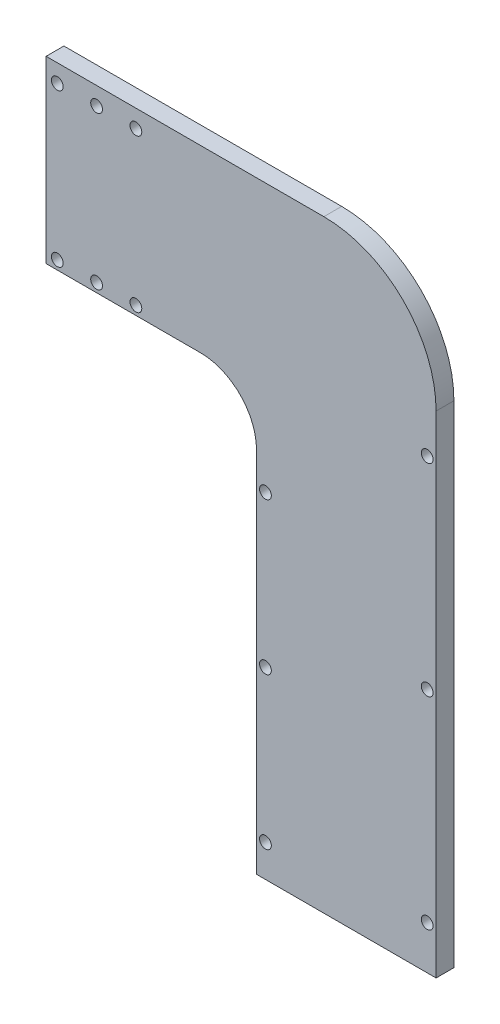
ISO-10303-21;
HEADER;
FILE_DESCRIPTION(('STEP AP214'),'2;1');
FILE_NAME('part.step','',(''),(''),'','','');
FILE_SCHEMA(('AUTOMOTIVE_DESIGN { 1 0 10303 214 1 1 1 1 }'));
ENDSEC;
DATA;
#1=APPLICATION_CONTEXT('core data for automotive mechanical design processes');
#2=APPLICATION_PROTOCOL_DEFINITION('international standard','automotive_design',2000,#1);
#3=PRODUCT_CONTEXT('',#1,'mechanical');
#4=PRODUCT('Part','Part','',(#3));
#5=PRODUCT_RELATED_PRODUCT_CATEGORY('part','',(#4));
#6=PRODUCT_DEFINITION_FORMATION('','',#4);
#7=PRODUCT_DEFINITION_CONTEXT('part definition',#1,'design');
#8=PRODUCT_DEFINITION('design','',#6,#7);
#9=PRODUCT_DEFINITION_SHAPE('','',#8);
#10=(LENGTH_UNIT() NAMED_UNIT(*) SI_UNIT(.MILLI.,.METRE.));
#11=(NAMED_UNIT(*) PLANE_ANGLE_UNIT() SI_UNIT($,.RADIAN.));
#12=(NAMED_UNIT(*) SI_UNIT($,.STERADIAN.) SOLID_ANGLE_UNIT());
#13=UNCERTAINTY_MEASURE_WITH_UNIT(LENGTH_MEASURE(1.E-05),#10,'distance_accuracy_value','');
#14=(GEOMETRIC_REPRESENTATION_CONTEXT(3) GLOBAL_UNCERTAINTY_ASSIGNED_CONTEXT((#13)) GLOBAL_UNIT_ASSIGNED_CONTEXT((#10,
#11,#12)) REPRESENTATION_CONTEXT('',''));
#15=CARTESIAN_POINT('',(0.,0.,0.));
#16=DIRECTION('',(0.,0.,1.));
#17=DIRECTION('',(1.,0.,0.));
#18=AXIS2_PLACEMENT_3D('',#15,#16,#17);
#19=CARTESIAN_POINT('',(-69.5,107.5,3.175));
#20=DIRECTION('',(1.,0.,0.));
#21=DIRECTION('',(0.,0.,-1.));
#22=AXIS2_PLACEMENT_3D('',#19,#20,#21);
#23=PLANE('',#22);
#24=DIRECTION('',(0.,-1.,0.));
#25=VECTOR('',#24,1.);
#26=CARTESIAN_POINT('',(-69.5,107.5,-3.175));
#27=LINE('',#26,#25);
#28=CARTESIAN_POINT('',(-69.5,107.5,-3.175));
#29=VERTEX_POINT('',#28);
#30=CARTESIAN_POINT('',(-69.5,43.5,-3.175));
#31=VERTEX_POINT('',#30);
#32=EDGE_CURVE('E122',#29,#31,#27,.T.);
#33=ORIENTED_EDGE('',*,*,#32,.T.);
#34=DIRECTION('',(0.,0.,-1.));
#35=VECTOR('',#34,1.);
#36=CARTESIAN_POINT('',(-69.5,43.5,3.175));
#37=LINE('',#36,#35);
#38=CARTESIAN_POINT('',(-69.5,43.5,3.175));
#39=VERTEX_POINT('',#38);
#40=EDGE_CURVE('E102',#39,#31,#37,.T.);
#41=ORIENTED_EDGE('',*,*,#40,.F.);
#42=DIRECTION('',(0.,-1.,0.));
#43=VECTOR('',#42,1.);
#44=CARTESIAN_POINT('',(-69.5,107.5,3.175));
#45=LINE('',#44,#43);
#46=CARTESIAN_POINT('',(-69.5,107.5,3.175));
#47=VERTEX_POINT('',#46);
#48=EDGE_CURVE('E108',#47,#39,#45,.T.);
#49=ORIENTED_EDGE('',*,*,#48,.F.);
#50=DIRECTION('',(0.,0.,-1.));
#51=VECTOR('',#50,1.);
#52=CARTESIAN_POINT('',(-69.5,107.5,3.175));
#53=LINE('',#52,#51);
#54=EDGE_CURVE('E162',#47,#29,#53,.T.);
#55=ORIENTED_EDGE('',*,*,#54,.T.);
#56=EDGE_LOOP('',(#33,#41,#49,#55));
#57=FACE_BOUND('',#56,.T.);
#58=ADVANCED_FACE('F39',(#57),#23,.F.);
#59=CARTESIAN_POINT('',(-69.5,43.5,3.175));
#60=DIRECTION('',(0.,1.,0.));
#61=DIRECTION('',(-1.,0.,0.));
#62=AXIS2_PLACEMENT_3D('',#59,#60,#61);
#63=PLANE('',#62);
#64=DIRECTION('',(1.,0.,0.));
#65=VECTOR('',#64,1.);
#66=CARTESIAN_POINT('',(-69.5,43.5,-3.175));
#67=LINE('',#66,#65);
#68=CARTESIAN_POINT('',(-14.5,43.5,-3.175));
#69=VERTEX_POINT('',#68);
#70=EDGE_CURVE('E153',#31,#69,#67,.T.);
#71=ORIENTED_EDGE('',*,*,#70,.T.);
#72=DIRECTION('',(0.,0.,-1.));
#73=VECTOR('',#72,1.);
#74=CARTESIAN_POINT('',(-14.5,43.5,3.175));
#75=LINE('',#74,#73);
#76=CARTESIAN_POINT('',(-14.5,43.5,3.175));
#77=VERTEX_POINT('',#76);
#78=EDGE_CURVE('E53',#69,#77,#75,.F.);
#79=ORIENTED_EDGE('',*,*,#78,.T.);
#80=DIRECTION('',(1.,0.,0.));
#81=VECTOR('',#80,1.);
#82=CARTESIAN_POINT('',(-69.5,43.5,3.175));
#83=LINE('',#82,#81);
#84=EDGE_CURVE('E99',#39,#77,#83,.T.);
#85=ORIENTED_EDGE('',*,*,#84,.F.);
#86=ORIENTED_EDGE('',*,*,#40,.T.);
#87=EDGE_LOOP('',(#71,#79,#85,#86));
#88=FACE_BOUND('',#87,.T.);
#89=ADVANCED_FACE('F105',(#88),#63,.F.);
#90=CARTESIAN_POINT('',(5.50000000000001,43.5,3.175));
#91=DIRECTION('',(1.,0.,0.));
#92=DIRECTION('',(0.,1.,0.));
#93=AXIS2_PLACEMENT_3D('',#90,#91,#92);
#94=PLANE('',#93);
#95=DIRECTION('',(0.,-1.,0.));
#96=VECTOR('',#95,1.);
#97=CARTESIAN_POINT('',(5.50000000000001,43.5,3.175));
#98=LINE('',#97,#96);
#99=CARTESIAN_POINT('',(5.50000000000001,23.5,3.175));
#100=VERTEX_POINT('',#99);
#101=CARTESIAN_POINT('',(5.50000000000002,-107.5,3.175));
#102=VERTEX_POINT('',#101);
#103=EDGE_CURVE('E107',#100,#102,#98,.T.);
#104=ORIENTED_EDGE('',*,*,#103,.F.);
#105=DIRECTION('',(0.,0.,-1.));
#106=VECTOR('',#105,1.);
#107=CARTESIAN_POINT('',(5.50000000000001,23.5,-3.175));
#108=LINE('',#107,#106);
#109=CARTESIAN_POINT('',(5.50000000000001,23.5,-3.175));
#110=VERTEX_POINT('',#109);
#111=EDGE_CURVE('E139',#100,#110,#108,.T.);
#112=ORIENTED_EDGE('',*,*,#111,.T.);
#113=DIRECTION('',(0.,-1.,0.));
#114=VECTOR('',#113,1.);
#115=CARTESIAN_POINT('',(5.50000000000001,43.5,-3.175));
#116=LINE('',#115,#114);
#117=CARTESIAN_POINT('',(5.50000000000002,-107.5,-3.175));
#118=VERTEX_POINT('',#117);
#119=EDGE_CURVE('E148',#110,#118,#116,.T.);
#120=ORIENTED_EDGE('',*,*,#119,.T.);
#121=DIRECTION('',(0.,0.,-1.));
#122=VECTOR('',#121,1.);
#123=CARTESIAN_POINT('',(5.50000000000002,-107.5,3.175));
#124=LINE('',#123,#122);
#125=EDGE_CURVE('E124',#102,#118,#124,.T.);
#126=ORIENTED_EDGE('',*,*,#125,.F.);
#127=EDGE_LOOP('',(#104,#112,#120,#126));
#128=FACE_BOUND('',#127,.T.);
#129=ADVANCED_FACE('F145',(#128),#94,.F.);
#130=CARTESIAN_POINT('',(5.50000000000002,-107.5,3.175));
#131=DIRECTION('',(0.,1.,0.));
#132=DIRECTION('',(0.,0.,1.));
#133=AXIS2_PLACEMENT_3D('',#130,#131,#132);
#134=PLANE('',#133);
#135=DIRECTION('',(1.,0.,0.));
#136=VECTOR('',#135,1.);
#137=CARTESIAN_POINT('',(5.50000000000002,-107.5,-3.175));
#138=LINE('',#137,#136);
#139=CARTESIAN_POINT('',(69.5,-107.5,-3.175));
#140=VERTEX_POINT('',#139);
#141=EDGE_CURVE('E155',#118,#140,#138,.T.);
#142=ORIENTED_EDGE('',*,*,#141,.T.);
#143=DIRECTION('',(0.,0.,-1.));
#144=VECTOR('',#143,1.);
#145=CARTESIAN_POINT('',(69.5,-107.5,3.175));
#146=LINE('',#145,#144);
#147=CARTESIAN_POINT('',(69.5,-107.5,3.175));
#148=VERTEX_POINT('',#147);
#149=EDGE_CURVE('E129',#148,#140,#146,.T.);
#150=ORIENTED_EDGE('',*,*,#149,.F.);
#151=DIRECTION('',(1.,0.,0.));
#152=VECTOR('',#151,1.);
#153=CARTESIAN_POINT('',(5.50000000000002,-107.5,3.175));
#154=LINE('',#153,#152);
#155=EDGE_CURVE('E182',#102,#148,#154,.T.);
#156=ORIENTED_EDGE('',*,*,#155,.F.);
#157=ORIENTED_EDGE('',*,*,#125,.T.);
#158=EDGE_LOOP('',(#142,#150,#156,#157));
#159=FACE_BOUND('',#158,.T.);
#160=ADVANCED_FACE('F197',(#159),#134,.F.);
#161=CARTESIAN_POINT('',(69.5,-107.5,3.175));
#162=DIRECTION('',(-1.,0.,0.));
#163=DIRECTION('',(0.,0.,1.));
#164=AXIS2_PLACEMENT_3D('',#161,#162,#163);
#165=PLANE('',#164);
#166=DIRECTION('',(0.,1.,0.));
#167=VECTOR('',#166,1.);
#168=CARTESIAN_POINT('',(69.5,-107.5,-3.175));
#169=LINE('',#168,#167);
#170=CARTESIAN_POINT('',(69.5,67.5,-3.175));
#171=VERTEX_POINT('',#170);
#172=EDGE_CURVE('E154',#140,#171,#169,.T.);
#173=ORIENTED_EDGE('',*,*,#172,.T.);
#174=DIRECTION('',(0.,0.,-1.));
#175=VECTOR('',#174,1.);
#176=CARTESIAN_POINT('',(69.5,67.5,3.175));
#177=LINE('',#176,#175);
#178=CARTESIAN_POINT('',(69.5,67.5,3.175));
#179=VERTEX_POINT('',#178);
#180=EDGE_CURVE('E131',#171,#179,#177,.F.);
#181=ORIENTED_EDGE('',*,*,#180,.T.);
#182=DIRECTION('',(0.,1.,0.));
#183=VECTOR('',#182,1.);
#184=CARTESIAN_POINT('',(69.5,-107.5,3.175));
#185=LINE('',#184,#183);
#186=EDGE_CURVE('E168',#148,#179,#185,.T.);
#187=ORIENTED_EDGE('',*,*,#186,.F.);
#188=ORIENTED_EDGE('',*,*,#149,.T.);
#189=EDGE_LOOP('',(#173,#181,#187,#188));
#190=FACE_BOUND('',#189,.T.);
#191=ADVANCED_FACE('F169',(#190),#165,.F.);
#192=CARTESIAN_POINT('',(-69.5,107.5,3.175));
#193=DIRECTION('',(0.,1.,0.));
#194=DIRECTION('',(0.,0.,1.));
#195=AXIS2_PLACEMENT_3D('',#192,#193,#194);
#196=PLANE('',#195);
#197=DIRECTION('',(1.,0.,0.));
#198=VECTOR('',#197,1.);
#199=CARTESIAN_POINT('',(-69.5,107.5,3.175));
#200=LINE('',#199,#198);
#201=CARTESIAN_POINT('',(29.5,107.5,3.175));
#202=VERTEX_POINT('',#201);
#203=EDGE_CURVE('E117',#47,#202,#200,.T.);
#204=ORIENTED_EDGE('',*,*,#203,.T.);
#205=DIRECTION('',(0.,0.,-1.));
#206=VECTOR('',#205,1.);
#207=CARTESIAN_POINT('',(29.5,107.5,-3.175));
#208=LINE('',#207,#206);
#209=CARTESIAN_POINT('',(29.5,107.5,-3.175));
#210=VERTEX_POINT('',#209);
#211=EDGE_CURVE('E125',#202,#210,#208,.T.);
#212=ORIENTED_EDGE('',*,*,#211,.T.);
#213=DIRECTION('',(1.,0.,0.));
#214=VECTOR('',#213,1.);
#215=CARTESIAN_POINT('',(-69.5,107.5,-3.175));
#216=LINE('',#215,#214);
#217=EDGE_CURVE('E120',#29,#210,#216,.T.);
#218=ORIENTED_EDGE('',*,*,#217,.F.);
#219=ORIENTED_EDGE('',*,*,#54,.F.);
#220=EDGE_LOOP('',(#204,#212,#218,#219));
#221=FACE_BOUND('',#220,.T.);
#222=ADVANCED_FACE('F176',(#221),#196,.T.);
#223=CARTESIAN_POINT('',(0.,0.,3.175));
#224=DIRECTION('',(0.,0.,1.));
#225=DIRECTION('',(1.,0.,0.));
#226=AXIS2_PLACEMENT_3D('',#223,#224,#225);
#227=PLANE('',#226);
#228=CARTESIAN_POINT('',(8.67500000000002,-96.,3.175));
#229=DIRECTION('',(0.,0.,1.));
#230=DIRECTION('',(1.,0.,0.));
#231=AXIS2_PLACEMENT_3D('',#228,#229,#230);
#232=CIRCLE('',#231,2.1);
#233=CARTESIAN_POINT('',(10.775,-96.,3.175));
#234=VERTEX_POINT('',#233);
#235=EDGE_CURVE('E404',#234,#234,#232,.T.);
#236=ORIENTED_EDGE('',*,*,#235,.F.);
#237=EDGE_LOOP('',(#236));
#238=FACE_BOUND('',#237,.T.);
#239=CARTESIAN_POINT('',(8.67500000000002,-42.,3.175));
#240=DIRECTION('',(0.,0.,1.));
#241=DIRECTION('',(1.,0.,0.));
#242=AXIS2_PLACEMENT_3D('',#239,#240,#241);
#243=CIRCLE('',#242,2.1);
#244=CARTESIAN_POINT('',(10.775,-42.,3.175));
#245=VERTEX_POINT('',#244);
#246=EDGE_CURVE('E403',#245,#245,#243,.T.);
#247=ORIENTED_EDGE('',*,*,#246,.F.);
#248=EDGE_LOOP('',(#247));
#249=FACE_BOUND('',#248,.T.);
#250=CARTESIAN_POINT('',(8.67500000000001,12.,3.175));
#251=DIRECTION('',(0.,0.,1.));
#252=DIRECTION('',(1.,0.,0.));
#253=AXIS2_PLACEMENT_3D('',#250,#251,#252);
#254=CIRCLE('',#253,2.1);
#255=CARTESIAN_POINT('',(10.775,12.,3.175));
#256=VERTEX_POINT('',#255);
#257=EDGE_CURVE('E413',#256,#256,#254,.T.);
#258=ORIENTED_EDGE('',*,*,#257,.F.);
#259=EDGE_LOOP('',(#258));
#260=FACE_BOUND('',#259,.T.);
#261=CARTESIAN_POINT('',(66.3250000000001,-92.,3.175));
#262=DIRECTION('',(0.,0.,1.));
#263=DIRECTION('',(1.,0.,0.));
#264=AXIS2_PLACEMENT_3D('',#261,#262,#263);
#265=CIRCLE('',#264,2.1);
#266=CARTESIAN_POINT('',(68.4250000000001,-92.,3.175));
#267=VERTEX_POINT('',#266);
#268=EDGE_CURVE('E422',#267,#267,#265,.T.);
#269=ORIENTED_EDGE('',*,*,#268,.F.);
#270=EDGE_LOOP('',(#269));
#271=FACE_BOUND('',#270,.T.);
#272=CARTESIAN_POINT('',(66.325,-20.,3.175));
#273=DIRECTION('',(0.,0.,1.));
#274=DIRECTION('',(1.,0.,0.));
#275=AXIS2_PLACEMENT_3D('',#272,#273,#274);
#276=CIRCLE('',#275,2.1);
#277=CARTESIAN_POINT('',(68.4250000000001,-20.,3.175));
#278=VERTEX_POINT('',#277);
#279=EDGE_CURVE('E428',#278,#278,#276,.T.);
#280=ORIENTED_EDGE('',*,*,#279,.F.);
#281=EDGE_LOOP('',(#280));
#282=FACE_BOUND('',#281,.T.);
#283=CARTESIAN_POINT('',(66.325,52.,3.175));
#284=DIRECTION('',(0.,0.,1.));
#285=DIRECTION('',(1.,0.,0.));
#286=AXIS2_PLACEMENT_3D('',#283,#284,#285);
#287=CIRCLE('',#286,2.1);
#288=CARTESIAN_POINT('',(68.425,52.,3.175));
#289=VERTEX_POINT('',#288);
#290=EDGE_CURVE('E432',#289,#289,#287,.T.);
#291=ORIENTED_EDGE('',*,*,#290,.F.);
#292=EDGE_LOOP('',(#291));
#293=FACE_BOUND('',#292,.T.);
#294=CARTESIAN_POINT('',(-65.5,101.15,3.175));
#295=DIRECTION('',(0.,0.,1.));
#296=DIRECTION('',(1.,0.,0.));
#297=AXIS2_PLACEMENT_3D('',#294,#295,#296);
#298=CIRCLE('',#297,2.1);
#299=CARTESIAN_POINT('',(-63.4,101.15,3.175));
#300=VERTEX_POINT('',#299);
#301=EDGE_CURVE('E452',#300,#300,#298,.T.);
#302=ORIENTED_EDGE('',*,*,#301,.F.);
#303=EDGE_LOOP('',(#302));
#304=FACE_BOUND('',#303,.T.);
#305=CARTESIAN_POINT('',(-51.5,46.675,3.175));
#306=DIRECTION('',(0.,0.,1.));
#307=DIRECTION('',(1.,0.,0.));
#308=AXIS2_PLACEMENT_3D('',#305,#306,#307);
#309=CIRCLE('',#308,2.1);
#310=CARTESIAN_POINT('',(-49.4,46.675,3.175));
#311=VERTEX_POINT('',#310);
#312=EDGE_CURVE('E443',#311,#311,#309,.T.);
#313=ORIENTED_EDGE('',*,*,#312,.F.);
#314=EDGE_LOOP('',(#313));
#315=FACE_BOUND('',#314,.T.);
#316=CARTESIAN_POINT('',(-65.5,46.675,3.175));
#317=DIRECTION('',(0.,0.,1.));
#318=DIRECTION('',(1.,0.,0.));
#319=AXIS2_PLACEMENT_3D('',#316,#317,#318);
#320=CIRCLE('',#319,2.09999999999999);
#321=CARTESIAN_POINT('',(-63.4,46.675,3.175));
#322=VERTEX_POINT('',#321);
#323=EDGE_CURVE('E458',#322,#322,#320,.T.);
#324=ORIENTED_EDGE('',*,*,#323,.F.);
#325=EDGE_LOOP('',(#324));
#326=FACE_BOUND('',#325,.T.);
#327=CARTESIAN_POINT('',(-37.5,101.15,3.175));
#328=DIRECTION('',(0.,0.,1.));
#329=DIRECTION('',(1.,0.,0.));
#330=AXIS2_PLACEMENT_3D('',#327,#328,#329);
#331=CIRCLE('',#330,2.1);
#332=CARTESIAN_POINT('',(-35.4,101.15,3.175));
#333=VERTEX_POINT('',#332);
#334=EDGE_CURVE('E192',#333,#333,#331,.T.);
#335=ORIENTED_EDGE('',*,*,#334,.F.);
#336=EDGE_LOOP('',(#335));
#337=FACE_BOUND('',#336,.T.);
#338=CARTESIAN_POINT('',(-37.5,46.675,3.175));
#339=DIRECTION('',(0.,0.,1.));
#340=DIRECTION('',(1.,0.,0.));
#341=AXIS2_PLACEMENT_3D('',#338,#339,#340);
#342=CIRCLE('',#341,2.1);
#343=CARTESIAN_POINT('',(-35.4,46.675,3.175));
#344=VERTEX_POINT('',#343);
#345=EDGE_CURVE('E438',#344,#344,#342,.T.);
#346=ORIENTED_EDGE('',*,*,#345,.F.);
#347=EDGE_LOOP('',(#346));
#348=FACE_BOUND('',#347,.T.);
#349=CARTESIAN_POINT('',(-51.5,101.15,3.175));
#350=DIRECTION('',(0.,0.,1.));
#351=DIRECTION('',(1.,0.,0.));
#352=AXIS2_PLACEMENT_3D('',#349,#350,#351);
#353=CIRCLE('',#352,2.1);
#354=CARTESIAN_POINT('',(-49.4,101.15,3.175));
#355=VERTEX_POINT('',#354);
#356=EDGE_CURVE('E187',#355,#355,#353,.T.);
#357=ORIENTED_EDGE('',*,*,#356,.F.);
#358=EDGE_LOOP('',(#357));
#359=FACE_BOUND('',#358,.T.);
#360=ORIENTED_EDGE('',*,*,#186,.T.);
#361=CARTESIAN_POINT('',(29.5,67.5,3.175));
#362=DIRECTION('',(0.,0.,1.));
#363=DIRECTION('',(1.,0.,0.));
#364=AXIS2_PLACEMENT_3D('',#361,#362,#363);
#365=CIRCLE('',#364,40.);
#366=EDGE_CURVE('E137',#179,#202,#365,.T.);
#367=ORIENTED_EDGE('',*,*,#366,.T.);
#368=ORIENTED_EDGE('',*,*,#203,.F.);
#369=ORIENTED_EDGE('',*,*,#48,.T.);
#370=ORIENTED_EDGE('',*,*,#84,.T.);
#371=CARTESIAN_POINT('',(-14.5,23.5,3.175));
#372=DIRECTION('',(0.,0.,1.));
#373=DIRECTION('',(1.,0.,0.));
#374=AXIS2_PLACEMENT_3D('',#371,#372,#373);
#375=CIRCLE('',#374,20.);
#376=EDGE_CURVE('E11',#77,#100,#375,.F.);
#377=ORIENTED_EDGE('',*,*,#376,.T.);
#378=ORIENTED_EDGE('',*,*,#103,.T.);
#379=ORIENTED_EDGE('',*,*,#155,.T.);
#380=EDGE_LOOP('',(#360,#367,#368,#369,#370,#377,#378,#379));
#381=FACE_BOUND('',#380,.T.);
#382=ADVANCED_FACE('F111',(#238,#249,#260,#271,#282,#293,#304,#315,#326,#337,#348,#359,#381),
#227,.T.);
#383=CARTESIAN_POINT('',(0.,0.,-3.175));
#384=DIRECTION('',(0.,0.,1.));
#385=DIRECTION('',(1.,0.,0.));
#386=AXIS2_PLACEMENT_3D('',#383,#384,#385);
#387=PLANE('',#386);
#388=CARTESIAN_POINT('',(8.67500000000002,-96.,-3.175));
#389=DIRECTION('',(0.,0.,1.));
#390=DIRECTION('',(1.,0.,0.));
#391=AXIS2_PLACEMENT_3D('',#388,#389,#390);
#392=CIRCLE('',#391,2.1);
#393=CARTESIAN_POINT('',(10.775,-96.,-3.175));
#394=VERTEX_POINT('',#393);
#395=EDGE_CURVE('E402',#394,#394,#392,.T.);
#396=ORIENTED_EDGE('',*,*,#395,.T.);
#397=EDGE_LOOP('',(#396));
#398=FACE_BOUND('',#397,.T.);
#399=CARTESIAN_POINT('',(8.67500000000002,-42.,-3.175));
#400=DIRECTION('',(0.,0.,1.));
#401=DIRECTION('',(1.,0.,0.));
#402=AXIS2_PLACEMENT_3D('',#399,#400,#401);
#403=CIRCLE('',#402,2.1);
#404=CARTESIAN_POINT('',(10.775,-42.,-3.175));
#405=VERTEX_POINT('',#404);
#406=EDGE_CURVE('E408',#405,#405,#403,.T.);
#407=ORIENTED_EDGE('',*,*,#406,.T.);
#408=EDGE_LOOP('',(#407));
#409=FACE_BOUND('',#408,.T.);
#410=CARTESIAN_POINT('',(8.67500000000001,12.,-3.175));
#411=DIRECTION('',(0.,0.,1.));
#412=DIRECTION('',(1.,0.,0.));
#413=AXIS2_PLACEMENT_3D('',#410,#411,#412);
#414=CIRCLE('',#413,2.1);
#415=CARTESIAN_POINT('',(10.775,12.,-3.175));
#416=VERTEX_POINT('',#415);
#417=EDGE_CURVE('E416',#416,#416,#414,.T.);
#418=ORIENTED_EDGE('',*,*,#417,.T.);
#419=EDGE_LOOP('',(#418));
#420=FACE_BOUND('',#419,.T.);
#421=CARTESIAN_POINT('',(66.3250000000001,-92.,-3.175));
#422=DIRECTION('',(0.,0.,1.));
#423=DIRECTION('',(1.,0.,0.));
#424=AXIS2_PLACEMENT_3D('',#421,#422,#423);
#425=CIRCLE('',#424,2.1);
#426=CARTESIAN_POINT('',(68.4250000000001,-92.,-3.175));
#427=VERTEX_POINT('',#426);
#428=EDGE_CURVE('E423',#427,#427,#425,.T.);
#429=ORIENTED_EDGE('',*,*,#428,.T.);
#430=EDGE_LOOP('',(#429));
#431=FACE_BOUND('',#430,.T.);
#432=CARTESIAN_POINT('',(66.325,-20.,-3.175));
#433=DIRECTION('',(0.,0.,1.));
#434=DIRECTION('',(1.,0.,0.));
#435=AXIS2_PLACEMENT_3D('',#432,#433,#434);
#436=CIRCLE('',#435,2.1);
#437=CARTESIAN_POINT('',(68.4250000000001,-20.,-3.175));
#438=VERTEX_POINT('',#437);
#439=EDGE_CURVE('E431',#438,#438,#436,.T.);
#440=ORIENTED_EDGE('',*,*,#439,.T.);
#441=EDGE_LOOP('',(#440));
#442=FACE_BOUND('',#441,.T.);
#443=CARTESIAN_POINT('',(66.325,52.,-3.175));
#444=DIRECTION('',(0.,0.,1.));
#445=DIRECTION('',(1.,0.,0.));
#446=AXIS2_PLACEMENT_3D('',#443,#444,#445);
#447=CIRCLE('',#446,2.1);
#448=CARTESIAN_POINT('',(68.425,52.,-3.175));
#449=VERTEX_POINT('',#448);
#450=EDGE_CURVE('E409',#449,#449,#447,.T.);
#451=ORIENTED_EDGE('',*,*,#450,.T.);
#452=EDGE_LOOP('',(#451));
#453=FACE_BOUND('',#452,.T.);
#454=CARTESIAN_POINT('',(-65.5,101.15,-3.175));
#455=DIRECTION('',(0.,0.,1.));
#456=DIRECTION('',(1.,0.,0.));
#457=AXIS2_PLACEMENT_3D('',#454,#455,#456);
#458=CIRCLE('',#457,2.1);
#459=CARTESIAN_POINT('',(-63.4,101.15,-3.175));
#460=VERTEX_POINT('',#459);
#461=EDGE_CURVE('E445',#460,#460,#458,.T.);
#462=ORIENTED_EDGE('',*,*,#461,.T.);
#463=EDGE_LOOP('',(#462));
#464=FACE_BOUND('',#463,.T.);
#465=CARTESIAN_POINT('',(-51.5,46.675,-3.175));
#466=DIRECTION('',(0.,0.,1.));
#467=DIRECTION('',(1.,0.,0.));
#468=AXIS2_PLACEMENT_3D('',#465,#466,#467);
#469=CIRCLE('',#468,2.1);
#470=CARTESIAN_POINT('',(-49.4,46.675,-3.175));
#471=VERTEX_POINT('',#470);
#472=EDGE_CURVE('E450',#471,#471,#469,.T.);
#473=ORIENTED_EDGE('',*,*,#472,.T.);
#474=EDGE_LOOP('',(#473));
#475=FACE_BOUND('',#474,.T.);
#476=CARTESIAN_POINT('',(-65.5,46.675,-3.175));
#477=DIRECTION('',(0.,0.,1.));
#478=DIRECTION('',(1.,0.,0.));
#479=AXIS2_PLACEMENT_3D('',#476,#477,#478);
#480=CIRCLE('',#479,2.09999999999999);
#481=CARTESIAN_POINT('',(-63.4,46.675,-3.175));
#482=VERTEX_POINT('',#481);
#483=EDGE_CURVE('E191',#482,#482,#480,.T.);
#484=ORIENTED_EDGE('',*,*,#483,.T.);
#485=EDGE_LOOP('',(#484));
#486=FACE_BOUND('',#485,.T.);
#487=CARTESIAN_POINT('',(-37.5,101.15,-3.175));
#488=DIRECTION('',(0.,0.,1.));
#489=DIRECTION('',(1.,0.,0.));
#490=AXIS2_PLACEMENT_3D('',#487,#488,#489);
#491=CIRCLE('',#490,2.1);
#492=CARTESIAN_POINT('',(-35.4,101.15,-3.175));
#493=VERTEX_POINT('',#492);
#494=EDGE_CURVE('E456',#493,#493,#491,.T.);
#495=ORIENTED_EDGE('',*,*,#494,.T.);
#496=EDGE_LOOP('',(#495));
#497=FACE_BOUND('',#496,.T.);
#498=CARTESIAN_POINT('',(-37.5,46.675,-3.175));
#499=DIRECTION('',(0.,0.,1.));
#500=DIRECTION('',(1.,0.,0.));
#501=AXIS2_PLACEMENT_3D('',#498,#499,#500);
#502=CIRCLE('',#501,2.1);
#503=CARTESIAN_POINT('',(-35.4,46.675,-3.175));
#504=VERTEX_POINT('',#503);
#505=EDGE_CURVE('E424',#504,#504,#502,.T.);
#506=ORIENTED_EDGE('',*,*,#505,.T.);
#507=EDGE_LOOP('',(#506));
#508=FACE_BOUND('',#507,.T.);
#509=CARTESIAN_POINT('',(-51.5,101.15,-3.175));
#510=DIRECTION('',(0.,0.,1.));
#511=DIRECTION('',(1.,0.,0.));
#512=AXIS2_PLACEMENT_3D('',#509,#510,#511);
#513=CIRCLE('',#512,2.1);
#514=CARTESIAN_POINT('',(-49.4,101.15,-3.175));
#515=VERTEX_POINT('',#514);
#516=EDGE_CURVE('E184',#515,#515,#513,.T.);
#517=ORIENTED_EDGE('',*,*,#516,.T.);
#518=EDGE_LOOP('',(#517));
#519=FACE_BOUND('',#518,.T.);
#520=ORIENTED_EDGE('',*,*,#217,.T.);
#521=CARTESIAN_POINT('',(29.5,67.5,-3.175));
#522=DIRECTION('',(0.,0.,1.));
#523=DIRECTION('',(1.,0.,0.));
#524=AXIS2_PLACEMENT_3D('',#521,#522,#523);
#525=CIRCLE('',#524,40.);
#526=EDGE_CURVE('E127',#210,#171,#525,.F.);
#527=ORIENTED_EDGE('',*,*,#526,.T.);
#528=ORIENTED_EDGE('',*,*,#172,.F.);
#529=ORIENTED_EDGE('',*,*,#141,.F.);
#530=ORIENTED_EDGE('',*,*,#119,.F.);
#531=CARTESIAN_POINT('',(-14.5,23.5,-3.175));
#532=DIRECTION('',(0.,0.,1.));
#533=DIRECTION('',(1.,0.,0.));
#534=AXIS2_PLACEMENT_3D('',#531,#532,#533);
#535=CIRCLE('',#534,20.);
#536=EDGE_CURVE('E50',#110,#69,#535,.T.);
#537=ORIENTED_EDGE('',*,*,#536,.T.);
#538=ORIENTED_EDGE('',*,*,#70,.F.);
#539=ORIENTED_EDGE('',*,*,#32,.F.);
#540=EDGE_LOOP('',(#520,#527,#528,#529,#530,#537,#538,#539));
#541=FACE_BOUND('',#540,.T.);
#542=ADVANCED_FACE('F147',(#398,#409,#420,#431,#442,#453,#464,#475,#486,#497,#508,#519,#541),
#387,.F.);
#543=CARTESIAN_POINT('',(29.5,67.5,3.175));
#544=DIRECTION('',(0.,0.,1.));
#545=DIRECTION('',(1.,0.,0.));
#546=AXIS2_PLACEMENT_3D('',#543,#544,#545);
#547=CYLINDRICAL_SURFACE('',#546,40.);
#548=ORIENTED_EDGE('',*,*,#366,.F.);
#549=ORIENTED_EDGE('',*,*,#180,.F.);
#550=ORIENTED_EDGE('',*,*,#526,.F.);
#551=ORIENTED_EDGE('',*,*,#211,.F.);
#552=EDGE_LOOP('',(#548,#549,#550,#551));
#553=FACE_BOUND('',#552,.T.);
#554=ADVANCED_FACE('F180',(#553),#547,.T.);
#555=CARTESIAN_POINT('',(-14.5,23.5,3.175));
#556=DIRECTION('',(0.,0.,1.));
#557=DIRECTION('',(1.,0.,0.));
#558=AXIS2_PLACEMENT_3D('',#555,#556,#557);
#559=CYLINDRICAL_SURFACE('',#558,20.);
#560=ORIENTED_EDGE('',*,*,#376,.F.);
#561=ORIENTED_EDGE('',*,*,#78,.F.);
#562=ORIENTED_EDGE('',*,*,#536,.F.);
#563=ORIENTED_EDGE('',*,*,#111,.F.);
#564=EDGE_LOOP('',(#560,#561,#562,#563));
#565=FACE_BOUND('',#564,.T.);
#566=ADVANCED_FACE('F41',(#565),#559,.F.);
#567=CARTESIAN_POINT('',(-51.5,101.15,-3.175));
#568=DIRECTION('',(0.,0.,1.));
#569=DIRECTION('',(1.,0.,0.));
#570=AXIS2_PLACEMENT_3D('',#567,#568,#569);
#571=CYLINDRICAL_SURFACE('',#570,2.1);
#572=ORIENTED_EDGE('',*,*,#516,.F.);
#573=EDGE_LOOP('',(#572));
#574=FACE_BOUND('',#573,.T.);
#575=ORIENTED_EDGE('',*,*,#356,.T.);
#576=EDGE_LOOP('',(#575));
#577=FACE_BOUND('',#576,.T.);
#578=ADVANCED_FACE('F220',(#574,#577),#571,.F.);
#579=CARTESIAN_POINT('',(-37.5,46.675,-3.175));
#580=DIRECTION('',(0.,0.,1.));
#581=DIRECTION('',(1.,0.,0.));
#582=AXIS2_PLACEMENT_3D('',#579,#580,#581);
#583=CYLINDRICAL_SURFACE('',#582,2.1);
#584=ORIENTED_EDGE('',*,*,#505,.F.);
#585=EDGE_LOOP('',(#584));
#586=FACE_BOUND('',#585,.T.);
#587=ORIENTED_EDGE('',*,*,#345,.T.);
#588=EDGE_LOOP('',(#587));
#589=FACE_BOUND('',#588,.T.);
#590=ADVANCED_FACE('F275',(#586,#589),#583,.F.);
#591=CARTESIAN_POINT('',(-37.5,101.15,-3.175));
#592=DIRECTION('',(0.,0.,1.));
#593=DIRECTION('',(1.,0.,0.));
#594=AXIS2_PLACEMENT_3D('',#591,#592,#593);
#595=CYLINDRICAL_SURFACE('',#594,2.1);
#596=ORIENTED_EDGE('',*,*,#494,.F.);
#597=EDGE_LOOP('',(#596));
#598=FACE_BOUND('',#597,.T.);
#599=ORIENTED_EDGE('',*,*,#334,.T.);
#600=EDGE_LOOP('',(#599));
#601=FACE_BOUND('',#600,.T.);
#602=ADVANCED_FACE('F278',(#598,#601),#595,.F.);
#603=CARTESIAN_POINT('',(-65.5,46.675,-3.175));
#604=DIRECTION('',(0.,0.,1.));
#605=DIRECTION('',(1.,0.,0.));
#606=AXIS2_PLACEMENT_3D('',#603,#604,#605);
#607=CYLINDRICAL_SURFACE('',#606,2.09999999999999);
#608=ORIENTED_EDGE('',*,*,#483,.F.);
#609=EDGE_LOOP('',(#608));
#610=FACE_BOUND('',#609,.T.);
#611=ORIENTED_EDGE('',*,*,#323,.T.);
#612=EDGE_LOOP('',(#611));
#613=FACE_BOUND('',#612,.T.);
#614=ADVANCED_FACE('F286',(#610,#613),#607,.F.);
#615=CARTESIAN_POINT('',(-51.5,46.675,-3.175));
#616=DIRECTION('',(0.,0.,1.));
#617=DIRECTION('',(1.,0.,0.));
#618=AXIS2_PLACEMENT_3D('',#615,#616,#617);
#619=CYLINDRICAL_SURFACE('',#618,2.1);
#620=ORIENTED_EDGE('',*,*,#472,.F.);
#621=EDGE_LOOP('',(#620));
#622=FACE_BOUND('',#621,.T.);
#623=ORIENTED_EDGE('',*,*,#312,.T.);
#624=EDGE_LOOP('',(#623));
#625=FACE_BOUND('',#624,.T.);
#626=ADVANCED_FACE('F300',(#622,#625),#619,.F.);
#627=CARTESIAN_POINT('',(-65.5,101.15,-3.175));
#628=DIRECTION('',(0.,0.,1.));
#629=DIRECTION('',(1.,0.,0.));
#630=AXIS2_PLACEMENT_3D('',#627,#628,#629);
#631=CYLINDRICAL_SURFACE('',#630,2.1);
#632=ORIENTED_EDGE('',*,*,#461,.F.);
#633=EDGE_LOOP('',(#632));
#634=FACE_BOUND('',#633,.T.);
#635=ORIENTED_EDGE('',*,*,#301,.T.);
#636=EDGE_LOOP('',(#635));
#637=FACE_BOUND('',#636,.T.);
#638=ADVANCED_FACE('F307',(#634,#637),#631,.F.);
#639=CARTESIAN_POINT('',(66.325,52.,-3.175));
#640=DIRECTION('',(0.,0.,1.));
#641=DIRECTION('',(1.,0.,0.));
#642=AXIS2_PLACEMENT_3D('',#639,#640,#641);
#643=CYLINDRICAL_SURFACE('',#642,2.1);
#644=ORIENTED_EDGE('',*,*,#450,.F.);
#645=EDGE_LOOP('',(#644));
#646=FACE_BOUND('',#645,.T.);
#647=ORIENTED_EDGE('',*,*,#290,.T.);
#648=EDGE_LOOP('',(#647));
#649=FACE_BOUND('',#648,.T.);
#650=ADVANCED_FACE('F316',(#646,#649),#643,.F.);
#651=CARTESIAN_POINT('',(66.325,-20.,-3.175));
#652=DIRECTION('',(0.,0.,1.));
#653=DIRECTION('',(1.,0.,0.));
#654=AXIS2_PLACEMENT_3D('',#651,#652,#653);
#655=CYLINDRICAL_SURFACE('',#654,2.1);
#656=ORIENTED_EDGE('',*,*,#439,.F.);
#657=EDGE_LOOP('',(#656));
#658=FACE_BOUND('',#657,.T.);
#659=ORIENTED_EDGE('',*,*,#279,.T.);
#660=EDGE_LOOP('',(#659));
#661=FACE_BOUND('',#660,.T.);
#662=ADVANCED_FACE('F324',(#658,#661),#655,.F.);
#663=CARTESIAN_POINT('',(66.3250000000001,-92.,-3.175));
#664=DIRECTION('',(0.,0.,1.));
#665=DIRECTION('',(1.,0.,0.));
#666=AXIS2_PLACEMENT_3D('',#663,#664,#665);
#667=CYLINDRICAL_SURFACE('',#666,2.1);
#668=ORIENTED_EDGE('',*,*,#428,.F.);
#669=EDGE_LOOP('',(#668));
#670=FACE_BOUND('',#669,.T.);
#671=ORIENTED_EDGE('',*,*,#268,.T.);
#672=EDGE_LOOP('',(#671));
#673=FACE_BOUND('',#672,.T.);
#674=ADVANCED_FACE('F331',(#670,#673),#667,.F.);
#675=CARTESIAN_POINT('',(8.67500000000001,12.,-3.175));
#676=DIRECTION('',(0.,0.,1.));
#677=DIRECTION('',(1.,0.,0.));
#678=AXIS2_PLACEMENT_3D('',#675,#676,#677);
#679=CYLINDRICAL_SURFACE('',#678,2.1);
#680=ORIENTED_EDGE('',*,*,#417,.F.);
#681=EDGE_LOOP('',(#680));
#682=FACE_BOUND('',#681,.T.);
#683=ORIENTED_EDGE('',*,*,#257,.T.);
#684=EDGE_LOOP('',(#683));
#685=FACE_BOUND('',#684,.T.);
#686=ADVANCED_FACE('F345',(#682,#685),#679,.F.);
#687=CARTESIAN_POINT('',(8.67500000000002,-42.,-3.175));
#688=DIRECTION('',(0.,0.,1.));
#689=DIRECTION('',(1.,0.,0.));
#690=AXIS2_PLACEMENT_3D('',#687,#688,#689);
#691=CYLINDRICAL_SURFACE('',#690,2.1);
#692=ORIENTED_EDGE('',*,*,#406,.F.);
#693=EDGE_LOOP('',(#692));
#694=FACE_BOUND('',#693,.T.);
#695=ORIENTED_EDGE('',*,*,#246,.T.);
#696=EDGE_LOOP('',(#695));
#697=FACE_BOUND('',#696,.T.);
#698=ADVANCED_FACE('F374',(#694,#697),#691,.F.);
#699=CARTESIAN_POINT('',(8.67500000000002,-96.,-3.175));
#700=DIRECTION('',(0.,0.,1.));
#701=DIRECTION('',(1.,0.,0.));
#702=AXIS2_PLACEMENT_3D('',#699,#700,#701);
#703=CYLINDRICAL_SURFACE('',#702,2.1);
#704=ORIENTED_EDGE('',*,*,#395,.F.);
#705=EDGE_LOOP('',(#704));
#706=FACE_BOUND('',#705,.T.);
#707=ORIENTED_EDGE('',*,*,#235,.T.);
#708=EDGE_LOOP('',(#707));
#709=FACE_BOUND('',#708,.T.);
#710=ADVANCED_FACE('F383',(#706,#709),#703,.F.);
#711=CLOSED_SHELL('',(#58,#89,#129,#160,#191,#222,#382,#542,#554,#566,#578,#590,#602,#614,#626,
#638,#650,#662,#674,#686,#698,#710));
#712=MANIFOLD_SOLID_BREP('B2',#711);
#713=ADVANCED_BREP_SHAPE_REPRESENTATION('',(#18,#712),#14);
#714=SHAPE_DEFINITION_REPRESENTATION(#9,#713);
ENDSEC;
END-ISO-10303-21;
